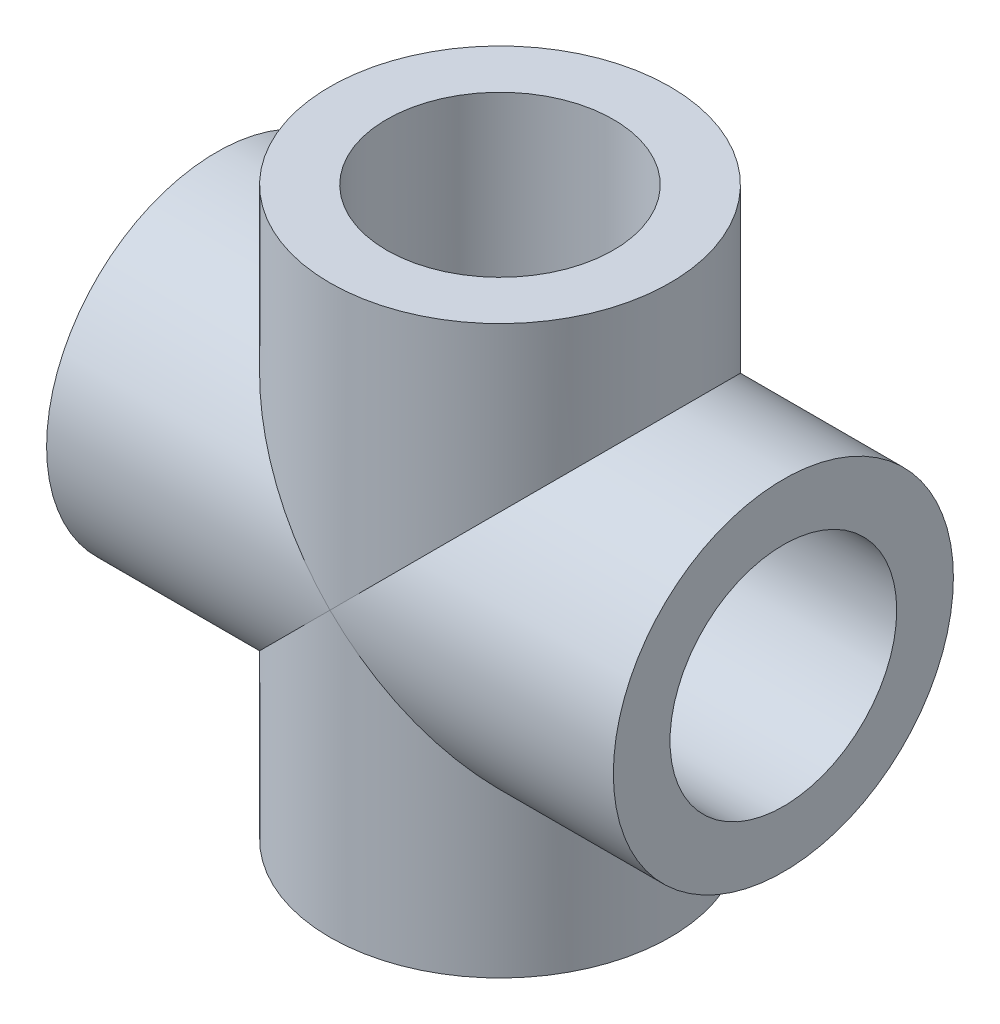
ISO-10303-21;
HEADER;
FILE_DESCRIPTION(('STEP AP214'),'2;1');
FILE_NAME('part.step','',(''),(''),'','','');
FILE_SCHEMA(('AUTOMOTIVE_DESIGN { 1 0 10303 214 1 1 1 1 }'));
ENDSEC;
DATA;
#1=APPLICATION_CONTEXT('core data for automotive mechanical design processes');
#2=APPLICATION_PROTOCOL_DEFINITION('international standard','automotive_design',2000,#1);
#3=PRODUCT_CONTEXT('',#1,'mechanical');
#4=PRODUCT('Part','Part','',(#3));
#5=PRODUCT_RELATED_PRODUCT_CATEGORY('part','',(#4));
#6=PRODUCT_DEFINITION_FORMATION('','',#4);
#7=PRODUCT_DEFINITION_CONTEXT('part definition',#1,'design');
#8=PRODUCT_DEFINITION('design','',#6,#7);
#9=PRODUCT_DEFINITION_SHAPE('','',#8);
#10=(LENGTH_UNIT() NAMED_UNIT(*) SI_UNIT(.MILLI.,.METRE.));
#11=(NAMED_UNIT(*) PLANE_ANGLE_UNIT() SI_UNIT($,.RADIAN.));
#12=(NAMED_UNIT(*) SI_UNIT($,.STERADIAN.) SOLID_ANGLE_UNIT());
#13=UNCERTAINTY_MEASURE_WITH_UNIT(LENGTH_MEASURE(1.E-05),#10,'distance_accuracy_value','');
#14=(GEOMETRIC_REPRESENTATION_CONTEXT(3) GLOBAL_UNCERTAINTY_ASSIGNED_CONTEXT((#13)) GLOBAL_UNIT_ASSIGNED_CONTEXT((#10,
#11,#12)) REPRESENTATION_CONTEXT('',''));
#15=CARTESIAN_POINT('',(0.,0.,0.));
#16=DIRECTION('',(0.,0.,1.));
#17=DIRECTION('',(1.,0.,0.));
#18=AXIS2_PLACEMENT_3D('',#15,#16,#17);
#19=CARTESIAN_POINT('',(25.,25.,0.));
#20=DIRECTION('',(-1.,0.,0.));
#21=DIRECTION('',(0.,0.,1.));
#22=AXIS2_PLACEMENT_3D('',#19,#20,#21);
#23=CYLINDRICAL_SURFACE('',#22,10.);
#24=CARTESIAN_POINT('',(0.,25.,0.));
#25=DIRECTION('',(-0.707106781186548,0.707106781186547,0.));
#26=DIRECTION('',(-0.707106781186548,-0.707106781186547,0.));
#27=AXIS2_PLACEMENT_3D('',#24,#25,#26);
#28=ELLIPSE('',#27,14.142135623731,10.);
#29=CARTESIAN_POINT('',(0.,25.,-10.));
#30=VERTEX_POINT('',#29);
#31=CARTESIAN_POINT('',(0.,25.,10.));
#32=VERTEX_POINT('',#31);
#33=EDGE_CURVE('E11',#30,#32,#28,.F.);
#34=ORIENTED_EDGE('',*,*,#33,.F.);
#35=CARTESIAN_POINT('',(0.,25.,0.));
#36=DIRECTION('',(-0.707106781186548,-0.707106781186547,0.));
#37=DIRECTION('',(-0.707106781186548,0.707106781186547,0.));
#38=AXIS2_PLACEMENT_3D('',#35,#36,#37);
#39=ELLIPSE('',#38,14.142135623731,10.);
#40=EDGE_CURVE('E56',#32,#30,#39,.F.);
#41=ORIENTED_EDGE('',*,*,#40,.F.);
#42=EDGE_LOOP('',(#34,#41));
#43=FACE_BOUND('',#42,.T.);
#44=CARTESIAN_POINT('',(25.,25.,0.));
#45=DIRECTION('',(1.,0.,0.));
#46=DIRECTION('',(0.,0.,-1.));
#47=AXIS2_PLACEMENT_3D('',#44,#45,#46);
#48=CIRCLE('',#47,10.);
#49=CARTESIAN_POINT('',(25.,25.,-10.));
#50=VERTEX_POINT('',#49);
#51=EDGE_CURVE('E124',#50,#50,#48,.T.);
#52=ORIENTED_EDGE('',*,*,#51,.T.);
#53=EDGE_LOOP('',(#52));
#54=FACE_BOUND('',#53,.T.);
#55=ADVANCED_FACE('F41',(#43,#54),#23,.F.);
#56=CARTESIAN_POINT('',(0.,50.,0.));
#57=DIRECTION('',(0.,-1.,0.));
#58=DIRECTION('',(0.,0.,-1.));
#59=AXIS2_PLACEMENT_3D('',#56,#57,#58);
#60=CYLINDRICAL_SURFACE('',#59,15.);
#61=CARTESIAN_POINT('',(0.,50.,0.));
#62=DIRECTION('',(0.,1.,0.));
#63=DIRECTION('',(0.,0.,1.));
#64=AXIS2_PLACEMENT_3D('',#61,#62,#63);
#65=CIRCLE('',#64,15.);
#66=CARTESIAN_POINT('',(0.,50.,15.));
#67=VERTEX_POINT('',#66);
#68=EDGE_CURVE('E81',#67,#67,#65,.T.);
#69=ORIENTED_EDGE('',*,*,#68,.F.);
#70=EDGE_LOOP('',(#69));
#71=FACE_BOUND('',#70,.T.);
#72=CARTESIAN_POINT('',(0.,25.,0.));
#73=DIRECTION('',(-0.707106781186547,-0.707106781186547,0.));
#74=DIRECTION('',(0.707106781186547,-0.707106781186547,0.));
#75=AXIS2_PLACEMENT_3D('',#72,#73,#74);
#76=ELLIPSE('',#75,21.2132034355964,15.);
#77=CARTESIAN_POINT('',(0.,25.,-15.));
#78=VERTEX_POINT('',#77);
#79=CARTESIAN_POINT('',(0.,25.,15.));
#80=VERTEX_POINT('',#79);
#81=EDGE_CURVE('E63',#78,#80,#76,.F.);
#82=ORIENTED_EDGE('',*,*,#81,.T.);
#83=CARTESIAN_POINT('',(0.,25.,0.));
#84=DIRECTION('',(0.707106781186547,-0.707106781186547,0.));
#85=DIRECTION('',(-0.707106781186547,-0.707106781186547,0.));
#86=AXIS2_PLACEMENT_3D('',#83,#84,#85);
#87=ELLIPSE('',#86,21.2132034355964,15.);
#88=EDGE_CURVE('E100',#80,#78,#87,.F.);
#89=ORIENTED_EDGE('',*,*,#88,.T.);
#90=EDGE_LOOP('',(#82,#89));
#91=FACE_BOUND('',#90,.T.);
#92=ADVANCED_FACE('F145',(#71,#91),#60,.T.);
#93=CARTESIAN_POINT('',(0.,50.,0.));
#94=DIRECTION('',(0.,-1.,0.));
#95=DIRECTION('',(0.,0.,-1.));
#96=AXIS2_PLACEMENT_3D('',#93,#94,#95);
#97=CYLINDRICAL_SURFACE('',#96,10.);
#98=CARTESIAN_POINT('',(0.,50.,0.));
#99=DIRECTION('',(0.,1.,0.));
#100=DIRECTION('',(0.,0.,1.));
#101=AXIS2_PLACEMENT_3D('',#98,#99,#100);
#102=CIRCLE('',#101,10.);
#103=CARTESIAN_POINT('',(0.,50.,10.));
#104=VERTEX_POINT('',#103);
#105=EDGE_CURVE('E92',#104,#104,#102,.T.);
#106=ORIENTED_EDGE('',*,*,#105,.T.);
#107=EDGE_LOOP('',(#106));
#108=FACE_BOUND('',#107,.T.);
#109=ORIENTED_EDGE('',*,*,#33,.T.);
#110=CARTESIAN_POINT('',(0.,25.,0.));
#111=DIRECTION('',(-0.707106781186548,-0.707106781186547,0.));
#112=DIRECTION('',(-0.707106781186548,0.707106781186547,0.));
#113=AXIS2_PLACEMENT_3D('',#110,#111,#112);
#114=ELLIPSE('',#113,14.142135623731,10.);
#115=EDGE_CURVE('E72',#32,#30,#114,.T.);
#116=ORIENTED_EDGE('',*,*,#115,.T.);
#117=EDGE_LOOP('',(#109,#116));
#118=FACE_BOUND('',#117,.T.);
#119=ADVANCED_FACE('F73',(#108,#118),#97,.F.);
#120=CARTESIAN_POINT('',(0.,50.,0.));
#121=DIRECTION('',(0.,1.,0.));
#122=DIRECTION('',(0.,0.,1.));
#123=AXIS2_PLACEMENT_3D('',#120,#121,#122);
#124=PLANE('',#123);
#125=ORIENTED_EDGE('',*,*,#68,.T.);
#126=EDGE_LOOP('',(#125));
#127=FACE_BOUND('',#126,.T.);
#128=ORIENTED_EDGE('',*,*,#105,.F.);
#129=EDGE_LOOP('',(#128));
#130=FACE_BOUND('',#129,.T.);
#131=ADVANCED_FACE('F153',(#127,#130),#124,.T.);
#132=CARTESIAN_POINT('',(-25.,0.,0.));
#133=DIRECTION('',(1.,0.,0.));
#134=DIRECTION('',(0.,0.,-1.));
#135=AXIS2_PLACEMENT_3D('',#132,#133,#134);
#136=PLANE('',#135);
#137=CARTESIAN_POINT('',(-25.,25.,0.));
#138=DIRECTION('',(1.,0.,0.));
#139=DIRECTION('',(0.,0.,-1.));
#140=AXIS2_PLACEMENT_3D('',#137,#138,#139);
#141=CIRCLE('',#140,10.);
#142=CARTESIAN_POINT('',(-25.,25.,-10.));
#143=VERTEX_POINT('',#142);
#144=EDGE_CURVE('E128',#143,#143,#141,.T.);
#145=ORIENTED_EDGE('',*,*,#144,.T.);
#146=EDGE_LOOP('',(#145));
#147=FACE_BOUND('',#146,.T.);
#148=CARTESIAN_POINT('',(-25.,25.,0.));
#149=DIRECTION('',(1.,0.,0.));
#150=DIRECTION('',(0.,0.,-1.));
#151=AXIS2_PLACEMENT_3D('',#148,#149,#150);
#152=CIRCLE('',#151,15.);
#153=CARTESIAN_POINT('',(-25.,25.,-15.));
#154=VERTEX_POINT('',#153);
#155=EDGE_CURVE('E116',#154,#154,#152,.T.);
#156=ORIENTED_EDGE('',*,*,#155,.F.);
#157=EDGE_LOOP('',(#156));
#158=FACE_BOUND('',#157,.T.);
#159=ADVANCED_FACE('F133',(#147,#158),#136,.F.);
#160=CARTESIAN_POINT('',(-25.,25.,0.));
#161=DIRECTION('',(1.,0.,0.));
#162=DIRECTION('',(0.,0.,-1.));
#163=AXIS2_PLACEMENT_3D('',#160,#161,#162);
#164=CYLINDRICAL_SURFACE('',#163,15.);
#165=ORIENTED_EDGE('',*,*,#155,.T.);
#166=EDGE_LOOP('',(#165));
#167=FACE_BOUND('',#166,.T.);
#168=CARTESIAN_POINT('',(0.,25.,0.));
#169=DIRECTION('',(0.707106781186547,-0.707106781186547,0.));
#170=DIRECTION('',(-0.707106781186547,-0.707106781186547,0.));
#171=AXIS2_PLACEMENT_3D('',#168,#169,#170);
#172=ELLIPSE('',#171,21.2132034355964,15.);
#173=EDGE_CURVE('E106',#80,#78,#172,.T.);
#174=ORIENTED_EDGE('',*,*,#173,.F.);
#175=ORIENTED_EDGE('',*,*,#81,.F.);
#176=EDGE_LOOP('',(#174,#175));
#177=FACE_BOUND('',#176,.T.);
#178=ADVANCED_FACE('F173',(#167,#177),#164,.T.);
#179=CARTESIAN_POINT('',(25.,25.,0.));
#180=DIRECTION('',(1.,0.,0.));
#181=DIRECTION('',(0.,0.,-1.));
#182=AXIS2_PLACEMENT_3D('',#179,#180,#181);
#183=CIRCLE('',#182,15.);
#184=CARTESIAN_POINT('',(25.,25.,-15.));
#185=VERTEX_POINT('',#184);
#186=EDGE_CURVE('E120',#185,#185,#183,.T.);
#187=ORIENTED_EDGE('',*,*,#186,.F.);
#188=EDGE_LOOP('',(#187));
#189=FACE_BOUND('',#188,.T.);
#190=ORIENTED_EDGE('',*,*,#88,.F.);
#191=CARTESIAN_POINT('',(0.,25.,0.));
#192=DIRECTION('',(-0.707106781186547,-0.707106781186547,0.));
#193=DIRECTION('',(0.707106781186547,-0.707106781186547,0.));
#194=AXIS2_PLACEMENT_3D('',#191,#192,#193);
#195=ELLIPSE('',#194,21.2132034355964,15.);
#196=EDGE_CURVE('E110',#78,#80,#195,.T.);
#197=ORIENTED_EDGE('',*,*,#196,.F.);
#198=EDGE_LOOP('',(#190,#197));
#199=FACE_BOUND('',#198,.T.);
#200=ADVANCED_FACE('F164',(#189,#199),#164,.T.);
#201=CARTESIAN_POINT('',(25.,0.,0.));
#202=DIRECTION('',(1.,0.,0.));
#203=DIRECTION('',(0.,0.,-1.));
#204=AXIS2_PLACEMENT_3D('',#201,#202,#203);
#205=PLANE('',#204);
#206=ORIENTED_EDGE('',*,*,#51,.F.);
#207=EDGE_LOOP('',(#206));
#208=FACE_BOUND('',#207,.T.);
#209=ORIENTED_EDGE('',*,*,#186,.T.);
#210=EDGE_LOOP('',(#209));
#211=FACE_BOUND('',#210,.T.);
#212=ADVANCED_FACE('F157',(#208,#211),#205,.T.);
#213=ORIENTED_EDGE('',*,*,#196,.T.);
#214=ORIENTED_EDGE('',*,*,#173,.T.);
#215=EDGE_LOOP('',(#213,#214));
#216=FACE_BOUND('',#215,.T.);
#217=CARTESIAN_POINT('',(0.,0.,0.));
#218=DIRECTION('',(0.,1.,0.));
#219=DIRECTION('',(0.,0.,1.));
#220=AXIS2_PLACEMENT_3D('',#217,#218,#219);
#221=CIRCLE('',#220,15.);
#222=CARTESIAN_POINT('',(0.,0.,15.));
#223=VERTEX_POINT('',#222);
#224=EDGE_CURVE('E88',#223,#223,#221,.T.);
#225=ORIENTED_EDGE('',*,*,#224,.T.);
#226=EDGE_LOOP('',(#225));
#227=FACE_BOUND('',#226,.T.);
#228=ADVANCED_FACE('F43',(#216,#227),#60,.T.);
#229=CARTESIAN_POINT('',(0.,0.,0.));
#230=DIRECTION('',(0.,1.,0.));
#231=DIRECTION('',(0.,0.,1.));
#232=AXIS2_PLACEMENT_3D('',#229,#230,#231);
#233=PLANE('',#232);
#234=ORIENTED_EDGE('',*,*,#224,.F.);
#235=EDGE_LOOP('',(#234));
#236=FACE_BOUND('',#235,.T.);
#237=CARTESIAN_POINT('',(0.,0.,0.));
#238=DIRECTION('',(0.,1.,0.));
#239=DIRECTION('',(0.,0.,1.));
#240=AXIS2_PLACEMENT_3D('',#237,#238,#239);
#241=CIRCLE('',#240,10.);
#242=CARTESIAN_POINT('',(0.,0.,10.));
#243=VERTEX_POINT('',#242);
#244=EDGE_CURVE('E96',#243,#243,#241,.T.);
#245=ORIENTED_EDGE('',*,*,#244,.T.);
#246=EDGE_LOOP('',(#245));
#247=FACE_BOUND('',#246,.T.);
#248=ADVANCED_FACE('F140',(#236,#247),#233,.F.);
#249=ORIENTED_EDGE('',*,*,#244,.F.);
#250=EDGE_LOOP('',(#249));
#251=FACE_BOUND('',#250,.T.);
#252=CARTESIAN_POINT('',(0.,25.,0.));
#253=DIRECTION('',(-0.707106781186548,0.707106781186547,0.));
#254=DIRECTION('',(-0.707106781186548,-0.707106781186547,0.));
#255=AXIS2_PLACEMENT_3D('',#252,#253,#254);
#256=ELLIPSE('',#255,14.142135623731,10.);
#257=EDGE_CURVE('E50',#30,#32,#256,.T.);
#258=ORIENTED_EDGE('',*,*,#257,.T.);
#259=ORIENTED_EDGE('',*,*,#40,.T.);
#260=EDGE_LOOP('',(#258,#259));
#261=FACE_BOUND('',#260,.T.);
#262=ADVANCED_FACE('F79',(#251,#261),#97,.F.);
#263=ORIENTED_EDGE('',*,*,#257,.F.);
#264=ORIENTED_EDGE('',*,*,#115,.F.);
#265=EDGE_LOOP('',(#263,#264));
#266=FACE_BOUND('',#265,.T.);
#267=ORIENTED_EDGE('',*,*,#144,.F.);
#268=EDGE_LOOP('',(#267));
#269=FACE_BOUND('',#268,.T.);
#270=ADVANCED_FACE('F84',(#266,#269),#23,.F.);
#271=CLOSED_SHELL('',(#55,#92,#119,#131,#159,#178,#200,#212,#228,#248,#262,#270));
#272=MANIFOLD_SOLID_BREP('B2',#271);
#273=ADVANCED_BREP_SHAPE_REPRESENTATION('',(#18,#272),#14);
#274=SHAPE_DEFINITION_REPRESENTATION(#9,#273);
ENDSEC;
END-ISO-10303-21;
